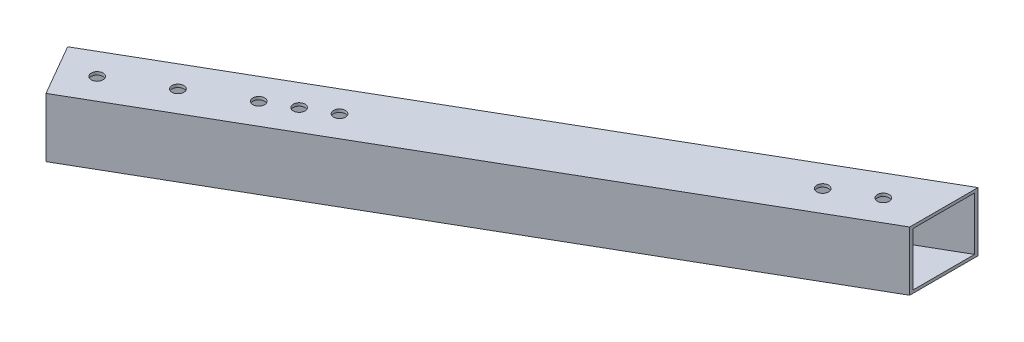
ISO-10303-21;
HEADER;
FILE_DESCRIPTION(('STEP AP214'),'2;1');
FILE_NAME('part.step','',(''),(''),'','','');
FILE_SCHEMA(('AUTOMOTIVE_DESIGN { 1 0 10303 214 1 1 1 1 }'));
ENDSEC;
DATA;
#1=APPLICATION_CONTEXT('core data for automotive mechanical design processes');
#2=APPLICATION_PROTOCOL_DEFINITION('international standard','automotive_design',2000,#1);
#3=PRODUCT_CONTEXT('',#1,'mechanical');
#4=PRODUCT('Part','Part','',(#3));
#5=PRODUCT_RELATED_PRODUCT_CATEGORY('part','',(#4));
#6=PRODUCT_DEFINITION_FORMATION('','',#4);
#7=PRODUCT_DEFINITION_CONTEXT('part definition',#1,'design');
#8=PRODUCT_DEFINITION('design','',#6,#7);
#9=PRODUCT_DEFINITION_SHAPE('','',#8);
#10=(LENGTH_UNIT() NAMED_UNIT(*) SI_UNIT(.MILLI.,.METRE.));
#11=(NAMED_UNIT(*) PLANE_ANGLE_UNIT() SI_UNIT($,.RADIAN.));
#12=(NAMED_UNIT(*) SI_UNIT($,.STERADIAN.) SOLID_ANGLE_UNIT());
#13=UNCERTAINTY_MEASURE_WITH_UNIT(LENGTH_MEASURE(1.E-05),#10,'distance_accuracy_value','');
#14=(GEOMETRIC_REPRESENTATION_CONTEXT(3) GLOBAL_UNCERTAINTY_ASSIGNED_CONTEXT((#13)) GLOBAL_UNIT_ASSIGNED_CONTEXT((#10,
#11,#12)) REPRESENTATION_CONTEXT('',''));
#15=CARTESIAN_POINT('',(0.,0.,0.));
#16=DIRECTION('',(0.,0.,1.));
#17=DIRECTION('',(1.,0.,0.));
#18=AXIS2_PLACEMENT_3D('',#15,#16,#17);
#19=CARTESIAN_POINT('',(-83.4815172738184,20.,51.4866802115003));
#20=DIRECTION('',(0.,-1.,0.));
#21=DIRECTION('',(0.,0.,-1.));
#22=AXIS2_PLACEMENT_3D('',#19,#20,#21);
#23=CYLINDRICAL_SURFACE('',#22,1.99999999999997);
#24=CARTESIAN_POINT('',(-83.4815172738184,1.,51.4866802115003));
#25=DIRECTION('',(0.,-1.,0.));
#26=DIRECTION('',(0.,0.,-1.));
#27=AXIS2_PLACEMENT_3D('',#24,#25,#26);
#28=CIRCLE('',#27,1.99999999999997);
#29=CARTESIAN_POINT('',(-83.4815172738184,1.,49.4866802115003));
#30=VERTEX_POINT('',#29);
#31=EDGE_CURVE('E194',#30,#30,#28,.T.);
#32=ORIENTED_EDGE('',*,*,#31,.F.);
#33=EDGE_LOOP('',(#32));
#34=FACE_BOUND('',#33,.T.);
#35=CARTESIAN_POINT('',(-83.4815172738184,0.,51.4866802115003));
#36=DIRECTION('',(0.,1.,0.));
#37=DIRECTION('',(0.,0.,1.));
#38=AXIS2_PLACEMENT_3D('',#35,#36,#37);
#39=CIRCLE('',#38,1.99999999999997);
#40=CARTESIAN_POINT('',(-83.4815172738184,0.,53.4866802115002));
#41=VERTEX_POINT('',#40);
#42=EDGE_CURVE('E247',#41,#41,#39,.T.);
#43=ORIENTED_EDGE('',*,*,#42,.F.);
#44=EDGE_LOOP('',(#43));
#45=FACE_BOUND('',#44,.T.);
#46=ADVANCED_FACE('F45',(#34,#45),#23,.F.);
#47=CARTESIAN_POINT('',(-66.1610091981294,20.,41.4866802115005));
#48=DIRECTION('',(0.,-1.,0.));
#49=DIRECTION('',(0.,0.,-1.));
#50=AXIS2_PLACEMENT_3D('',#47,#48,#49);
#51=CYLINDRICAL_SURFACE('',#50,2.00000000000002);
#52=CARTESIAN_POINT('',(-66.1610091981294,1.00000000000001,41.4866802115005));
#53=DIRECTION('',(0.,-1.,0.));
#54=DIRECTION('',(0.,0.,-1.));
#55=AXIS2_PLACEMENT_3D('',#52,#53,#54);
#56=CIRCLE('',#55,2.00000000000002);
#57=CARTESIAN_POINT('',(-66.1610091981294,1.00000000000001,39.4866802115005));
#58=VERTEX_POINT('',#57);
#59=EDGE_CURVE('E190',#58,#58,#56,.T.);
#60=ORIENTED_EDGE('',*,*,#59,.F.);
#61=EDGE_LOOP('',(#60));
#62=FACE_BOUND('',#61,.T.);
#63=CARTESIAN_POINT('',(-66.1610091981294,0.,41.4866802115005));
#64=DIRECTION('',(0.,1.,0.));
#65=DIRECTION('',(0.,0.,1.));
#66=AXIS2_PLACEMENT_3D('',#63,#64,#65);
#67=CIRCLE('',#66,2.00000000000002);
#68=CARTESIAN_POINT('',(-66.1610091981294,0.,43.4866802115005));
#69=VERTEX_POINT('',#68);
#70=EDGE_CURVE('E239',#69,#69,#67,.T.);
#71=ORIENTED_EDGE('',*,*,#70,.F.);
#72=EDGE_LOOP('',(#71));
#73=FACE_BOUND('',#72,.T.);
#74=ADVANCED_FACE('F326',(#62,#73),#51,.F.);
#75=CARTESIAN_POINT('',(-48.8696225304549,20.,31.4379725042907));
#76=DIRECTION('',(0.,-1.,0.));
#77=DIRECTION('',(0.,0.,-1.));
#78=AXIS2_PLACEMENT_3D('',#75,#76,#77);
#79=CYLINDRICAL_SURFACE('',#78,2.);
#80=CARTESIAN_POINT('',(-48.8696225304549,1.,31.4379725042907));
#81=DIRECTION('',(0.,-1.,0.));
#82=DIRECTION('',(0.,0.,-1.));
#83=AXIS2_PLACEMENT_3D('',#80,#81,#82);
#84=CIRCLE('',#83,2.);
#85=CARTESIAN_POINT('',(-48.8696225304549,1.,29.4379725042907));
#86=VERTEX_POINT('',#85);
#87=EDGE_CURVE('E186',#86,#86,#84,.T.);
#88=ORIENTED_EDGE('',*,*,#87,.F.);
#89=EDGE_LOOP('',(#88));
#90=FACE_BOUND('',#89,.T.);
#91=CARTESIAN_POINT('',(-48.8696225304549,0.,31.4379725042907));
#92=DIRECTION('',(0.,1.,0.));
#93=DIRECTION('',(0.,0.,1.));
#94=AXIS2_PLACEMENT_3D('',#91,#92,#93);
#95=CIRCLE('',#94,2.);
#96=CARTESIAN_POINT('',(-48.8696225304549,0.,33.4379725042907));
#97=VERTEX_POINT('',#96);
#98=EDGE_CURVE('E231',#97,#97,#95,.T.);
#99=ORIENTED_EDGE('',*,*,#98,.F.);
#100=EDGE_LOOP('',(#99));
#101=FACE_BOUND('',#100,.T.);
#102=ADVANCED_FACE('F334',(#90,#101),#79,.F.);
#103=CARTESIAN_POINT('',(-40.2093684926109,20.,26.4379725042909));
#104=DIRECTION('',(0.,-1.,0.));
#105=DIRECTION('',(0.,0.,-1.));
#106=AXIS2_PLACEMENT_3D('',#103,#104,#105);
#107=CYLINDRICAL_SURFACE('',#106,2.00000000000002);
#108=CARTESIAN_POINT('',(-40.2093684926109,1.,26.4379725042909));
#109=DIRECTION('',(0.,-1.,0.));
#110=DIRECTION('',(0.,0.,-1.));
#111=AXIS2_PLACEMENT_3D('',#108,#109,#110);
#112=CIRCLE('',#111,2.00000000000002);
#113=CARTESIAN_POINT('',(-40.2093684926109,1.,24.4379725042909));
#114=VERTEX_POINT('',#113);
#115=EDGE_CURVE('E182',#114,#114,#112,.T.);
#116=ORIENTED_EDGE('',*,*,#115,.F.);
#117=EDGE_LOOP('',(#116));
#118=FACE_BOUND('',#117,.T.);
#119=CARTESIAN_POINT('',(-40.2093684926109,0.,26.4379725042909));
#120=DIRECTION('',(0.,1.,0.));
#121=DIRECTION('',(0.,0.,1.));
#122=AXIS2_PLACEMENT_3D('',#119,#120,#121);
#123=CIRCLE('',#122,2.00000000000002);
#124=CARTESIAN_POINT('',(-40.2093684926109,0.,28.4379725042909));
#125=VERTEX_POINT('',#124);
#126=EDGE_CURVE('E223',#125,#125,#123,.T.);
#127=ORIENTED_EDGE('',*,*,#126,.F.);
#128=EDGE_LOOP('',(#127));
#129=FACE_BOUND('',#128,.T.);
#130=ADVANCED_FACE('F449',(#118,#129),#107,.F.);
#131=CARTESIAN_POINT('',(-31.5491144547664,20.,21.4379725042909));
#132=DIRECTION('',(0.,-1.,0.));
#133=DIRECTION('',(0.,0.,-1.));
#134=AXIS2_PLACEMENT_3D('',#131,#132,#133);
#135=CYLINDRICAL_SURFACE('',#134,1.99999999999957);
#136=CARTESIAN_POINT('',(-31.5491144547664,1.,21.4379725042909));
#137=DIRECTION('',(0.,-1.,0.));
#138=DIRECTION('',(0.,0.,-1.));
#139=AXIS2_PLACEMENT_3D('',#136,#137,#138);
#140=CIRCLE('',#139,1.99999999999957);
#141=CARTESIAN_POINT('',(-31.5491144547664,1.,19.4379725042913));
#142=VERTEX_POINT('',#141);
#143=EDGE_CURVE('E178',#142,#142,#140,.T.);
#144=ORIENTED_EDGE('',*,*,#143,.F.);
#145=EDGE_LOOP('',(#144));
#146=FACE_BOUND('',#145,.T.);
#147=CARTESIAN_POINT('',(-31.5491144547664,0.,21.4379725042909));
#148=DIRECTION('',(0.,1.,0.));
#149=DIRECTION('',(0.,0.,1.));
#150=AXIS2_PLACEMENT_3D('',#147,#148,#149);
#151=CIRCLE('',#150,1.99999999999957);
#152=CARTESIAN_POINT('',(-31.5491144547664,0.,23.4379725042905));
#153=VERTEX_POINT('',#152);
#154=EDGE_CURVE('E215',#153,#153,#151,.T.);
#155=ORIENTED_EDGE('',*,*,#154,.F.);
#156=EDGE_LOOP('',(#155));
#157=FACE_BOUND('',#156,.T.);
#158=ADVANCED_FACE('F388',(#146,#157),#135,.F.);
#159=CARTESIAN_POINT('',(72.0554584989076,20.,-38.3781555797895));
#160=DIRECTION('',(0.,-1.,0.));
#161=DIRECTION('',(0.,0.,-1.));
#162=AXIS2_PLACEMENT_3D('',#159,#160,#161);
#163=CYLINDRICAL_SURFACE('',#162,2.);
#164=CARTESIAN_POINT('',(72.0554584989076,1.,-38.3781555797895));
#165=DIRECTION('',(0.,-1.,0.));
#166=DIRECTION('',(0.,0.,-1.));
#167=AXIS2_PLACEMENT_3D('',#164,#165,#166);
#168=CIRCLE('',#167,2.);
#169=CARTESIAN_POINT('',(72.0554584989076,1.,-40.3781555797895));
#170=VERTEX_POINT('',#169);
#171=EDGE_CURVE('E174',#170,#170,#168,.T.);
#172=ORIENTED_EDGE('',*,*,#171,.F.);
#173=EDGE_LOOP('',(#172));
#174=FACE_BOUND('',#173,.T.);
#175=CARTESIAN_POINT('',(72.0554584989076,0.,-38.3781555797895));
#176=DIRECTION('',(0.,1.,0.));
#177=DIRECTION('',(0.,0.,1.));
#178=AXIS2_PLACEMENT_3D('',#175,#176,#177);
#179=CIRCLE('',#178,2.);
#180=CARTESIAN_POINT('',(72.0554584989076,0.,-36.3781555797895));
#181=VERTEX_POINT('',#180);
#182=EDGE_CURVE('E207',#181,#181,#179,.T.);
#183=ORIENTED_EDGE('',*,*,#182,.F.);
#184=EDGE_LOOP('',(#183));
#185=FACE_BOUND('',#184,.T.);
#186=ADVANCED_FACE('F380',(#174,#185),#163,.F.);
#187=CARTESIAN_POINT('',(85.0458395556742,20.,-45.8781555797896));
#188=DIRECTION('',(0.,-1.,0.));
#189=DIRECTION('',(0.,0.,-1.));
#190=AXIS2_PLACEMENT_3D('',#187,#188,#189);
#191=CYLINDRICAL_SURFACE('',#190,2.00000000000004);
#192=CARTESIAN_POINT('',(85.0458395556742,1.,-45.8781555797896));
#193=DIRECTION('',(0.,-1.,0.));
#194=DIRECTION('',(0.,0.,-1.));
#195=AXIS2_PLACEMENT_3D('',#192,#193,#194);
#196=CIRCLE('',#195,2.00000000000004);
#197=CARTESIAN_POINT('',(85.0458395556742,1.,-47.8781555797896));
#198=VERTEX_POINT('',#197);
#199=EDGE_CURVE('E173',#198,#198,#196,.T.);
#200=ORIENTED_EDGE('',*,*,#199,.F.);
#201=EDGE_LOOP('',(#200));
#202=FACE_BOUND('',#201,.T.);
#203=CARTESIAN_POINT('',(85.0458395556742,0.,-45.8781555797896));
#204=DIRECTION('',(0.,1.,0.));
#205=DIRECTION('',(0.,0.,1.));
#206=AXIS2_PLACEMENT_3D('',#203,#204,#205);
#207=CIRCLE('',#206,2.00000000000004);
#208=CARTESIAN_POINT('',(85.0458395556742,0.,-43.8781555797895));
#209=VERTEX_POINT('',#208);
#210=EDGE_CURVE('E202',#209,#209,#207,.T.);
#211=ORIENTED_EDGE('',*,*,#210,.F.);
#212=EDGE_LOOP('',(#211));
#213=FACE_BOUND('',#212,.T.);
#214=ADVANCED_FACE('F359',(#202,#213),#191,.F.);
#215=CARTESIAN_POINT('',(0.,20.,0.));
#216=DIRECTION('',(0.,1.,0.));
#217=DIRECTION('',(0.,0.,1.));
#218=AXIS2_PLACEMENT_3D('',#215,#216,#217);
#219=PLANE('',#218);
#220=CARTESIAN_POINT('',(72.0554584989076,20.,-38.3781555797895));
#221=DIRECTION('',(0.,1.,0.));
#222=DIRECTION('',(0.,0.,1.));
#223=AXIS2_PLACEMENT_3D('',#220,#221,#222);
#224=CIRCLE('',#223,2.);
#225=CARTESIAN_POINT('',(72.0554584989076,20.,-36.3781555797895));
#226=VERTEX_POINT('',#225);
#227=EDGE_CURVE('E211',#226,#226,#224,.T.);
#228=ORIENTED_EDGE('',*,*,#227,.F.);
#229=EDGE_LOOP('',(#228));
#230=FACE_BOUND('',#229,.T.);
#231=CARTESIAN_POINT('',(-40.2093684926109,20.,26.4379725042909));
#232=DIRECTION('',(0.,1.,0.));
#233=DIRECTION('',(0.,0.,1.));
#234=AXIS2_PLACEMENT_3D('',#231,#232,#233);
#235=CIRCLE('',#234,2.00000000000002);
#236=CARTESIAN_POINT('',(-40.2093684926109,20.,28.4379725042909));
#237=VERTEX_POINT('',#236);
#238=EDGE_CURVE('E227',#237,#237,#235,.T.);
#239=ORIENTED_EDGE('',*,*,#238,.F.);
#240=EDGE_LOOP('',(#239));
#241=FACE_BOUND('',#240,.T.);
#242=CARTESIAN_POINT('',(-66.1610091981294,20.,41.4866802115005));
#243=DIRECTION('',(0.,1.,0.));
#244=DIRECTION('',(0.,0.,1.));
#245=AXIS2_PLACEMENT_3D('',#242,#243,#244);
#246=CIRCLE('',#245,2.00000000000002);
#247=CARTESIAN_POINT('',(-66.1610091981294,20.,43.4866802115005));
#248=VERTEX_POINT('',#247);
#249=EDGE_CURVE('E243',#248,#248,#246,.T.);
#250=ORIENTED_EDGE('',*,*,#249,.F.);
#251=EDGE_LOOP('',(#250));
#252=FACE_BOUND('',#251,.T.);
#253=DIRECTION('',(-0.866025403784439,0.,0.5));
#254=VECTOR('',#253,1.);
#255=CARTESIAN_POINT('',(-97.1708927196769,20.,47.777718466446));
#256=LINE('',#255,#254);
#257=CARTESIAN_POINT('',(98.0362206124406,20.,-64.9251609635819));
#258=VERTEX_POINT('',#257);
#259=CARTESIAN_POINT('',(-97.1708927196769,20.,47.777718466446));
#260=VERTEX_POINT('',#259);
#261=EDGE_CURVE('E259',#258,#260,#256,.T.);
#262=ORIENTED_EDGE('',*,*,#261,.T.);
#263=DIRECTION('',(0.500000000000001,0.,0.866025403784438));
#264=VECTOR('',#263,1.);
#265=CARTESIAN_POINT('',(-87.1708927196769,20.,65.0982265421347));
#266=LINE('',#265,#264);
#267=CARTESIAN_POINT('',(-87.1708927196769,20.,65.0982265421347));
#268=VERTEX_POINT('',#267);
#269=EDGE_CURVE('E263',#260,#268,#266,.T.);
#270=ORIENTED_EDGE('',*,*,#269,.T.);
#271=DIRECTION('',(0.866025403784438,0.,-0.500000000000001));
#272=VECTOR('',#271,1.);
#273=CARTESIAN_POINT('',(98.0362206124406,20.,-41.8311501959971));
#274=LINE('',#273,#272);
#275=CARTESIAN_POINT('',(98.0362206124406,20.,-41.8311501959971));
#276=VERTEX_POINT('',#275);
#277=EDGE_CURVE('E267',#268,#276,#274,.T.);
#278=ORIENTED_EDGE('',*,*,#277,.T.);
#279=DIRECTION('',(0.,0.,-1.));
#280=VECTOR('',#279,1.);
#281=CARTESIAN_POINT('',(98.0362206124406,20.,-64.9251609635819));
#282=LINE('',#281,#280);
#283=EDGE_CURVE('E270',#276,#258,#282,.T.);
#284=ORIENTED_EDGE('',*,*,#283,.T.);
#285=EDGE_LOOP('',(#262,#270,#278,#284));
#286=FACE_BOUND('',#285,.T.);
#287=CARTESIAN_POINT('',(-83.4815172738184,20.,51.4866802115003));
#288=DIRECTION('',(0.,1.,0.));
#289=DIRECTION('',(0.,0.,1.));
#290=AXIS2_PLACEMENT_3D('',#287,#288,#289);
#291=CIRCLE('',#290,1.99999999999997);
#292=CARTESIAN_POINT('',(-83.4815172738184,20.,53.4866802115002));
#293=VERTEX_POINT('',#292);
#294=EDGE_CURVE('E251',#293,#293,#291,.T.);
#295=ORIENTED_EDGE('',*,*,#294,.F.);
#296=EDGE_LOOP('',(#295));
#297=FACE_BOUND('',#296,.T.);
#298=CARTESIAN_POINT('',(-48.8696225304549,20.,31.4379725042907));
#299=DIRECTION('',(0.,1.,0.));
#300=DIRECTION('',(0.,0.,1.));
#301=AXIS2_PLACEMENT_3D('',#298,#299,#300);
#302=CIRCLE('',#301,2.);
#303=CARTESIAN_POINT('',(-48.8696225304549,20.,33.4379725042907));
#304=VERTEX_POINT('',#303);
#305=EDGE_CURVE('E235',#304,#304,#302,.T.);
#306=ORIENTED_EDGE('',*,*,#305,.F.);
#307=EDGE_LOOP('',(#306));
#308=FACE_BOUND('',#307,.T.);
#309=CARTESIAN_POINT('',(-31.5491144547664,20.,21.4379725042909));
#310=DIRECTION('',(0.,1.,0.));
#311=DIRECTION('',(0.,0.,1.));
#312=AXIS2_PLACEMENT_3D('',#309,#310,#311);
#313=CIRCLE('',#312,1.99999999999957);
#314=CARTESIAN_POINT('',(-31.5491144547664,20.,23.4379725042905));
#315=VERTEX_POINT('',#314);
#316=EDGE_CURVE('E219',#315,#315,#313,.T.);
#317=ORIENTED_EDGE('',*,*,#316,.F.);
#318=EDGE_LOOP('',(#317));
#319=FACE_BOUND('',#318,.T.);
#320=CARTESIAN_POINT('',(85.0458395556742,20.,-45.8781555797896));
#321=DIRECTION('',(0.,1.,0.));
#322=DIRECTION('',(0.,0.,1.));
#323=AXIS2_PLACEMENT_3D('',#320,#321,#322);
#324=CIRCLE('',#323,2.00000000000004);
#325=CARTESIAN_POINT('',(85.0458395556742,20.,-43.8781555797895));
#326=VERTEX_POINT('',#325);
#327=EDGE_CURVE('E203',#326,#326,#324,.T.);
#328=ORIENTED_EDGE('',*,*,#327,.F.);
#329=EDGE_LOOP('',(#328));
#330=FACE_BOUND('',#329,.T.);
#331=ADVANCED_FACE('F355',(#230,#241,#252,#286,#297,#308,#319,#330),#219,.T.);
#332=CARTESIAN_POINT('',(0.,0.,0.));
#333=DIRECTION('',(0.,1.,0.));
#334=DIRECTION('',(0.,0.,1.));
#335=AXIS2_PLACEMENT_3D('',#332,#333,#334);
#336=PLANE('',#335);
#337=DIRECTION('',(-0.866025403784439,0.,0.5));
#338=VECTOR('',#337,1.);
#339=CARTESIAN_POINT('',(-97.1708927196769,0.,47.777718466446));
#340=LINE('',#339,#338);
#341=CARTESIAN_POINT('',(98.0362206124406,0.,-64.9251609635819));
#342=VERTEX_POINT('',#341);
#343=CARTESIAN_POINT('',(-97.1708927196769,0.,47.777718466446));
#344=VERTEX_POINT('',#343);
#345=EDGE_CURVE('E255',#342,#344,#340,.T.);
#346=ORIENTED_EDGE('',*,*,#345,.F.);
#347=DIRECTION('',(0.,0.,-1.));
#348=VECTOR('',#347,1.);
#349=CARTESIAN_POINT('',(98.0362206124406,0.,-64.9251609635819));
#350=LINE('',#349,#348);
#351=CARTESIAN_POINT('',(98.0362206124406,0.,-41.8311501959971));
#352=VERTEX_POINT('',#351);
#353=EDGE_CURVE('E264',#352,#342,#350,.T.);
#354=ORIENTED_EDGE('',*,*,#353,.F.);
#355=DIRECTION('',(0.866025403784438,0.,-0.500000000000001));
#356=VECTOR('',#355,1.);
#357=CARTESIAN_POINT('',(98.0362206124406,0.,-41.8311501959971));
#358=LINE('',#357,#356);
#359=CARTESIAN_POINT('',(-87.1708927196769,0.,65.0982265421347));
#360=VERTEX_POINT('',#359);
#361=EDGE_CURVE('E280',#360,#352,#358,.T.);
#362=ORIENTED_EDGE('',*,*,#361,.F.);
#363=DIRECTION('',(0.500000000000001,0.,0.866025403784438));
#364=VECTOR('',#363,1.);
#365=CARTESIAN_POINT('',(-87.1708927196769,0.,65.0982265421347));
#366=LINE('',#365,#364);
#367=EDGE_CURVE('E277',#344,#360,#366,.T.);
#368=ORIENTED_EDGE('',*,*,#367,.F.);
#369=EDGE_LOOP('',(#346,#354,#362,#368));
#370=FACE_BOUND('',#369,.T.);
#371=ORIENTED_EDGE('',*,*,#42,.T.);
#372=EDGE_LOOP('',(#371));
#373=FACE_BOUND('',#372,.T.);
#374=ORIENTED_EDGE('',*,*,#70,.T.);
#375=EDGE_LOOP('',(#374));
#376=FACE_BOUND('',#375,.T.);
#377=ORIENTED_EDGE('',*,*,#98,.T.);
#378=EDGE_LOOP('',(#377));
#379=FACE_BOUND('',#378,.T.);
#380=ORIENTED_EDGE('',*,*,#126,.T.);
#381=EDGE_LOOP('',(#380));
#382=FACE_BOUND('',#381,.T.);
#383=ORIENTED_EDGE('',*,*,#154,.T.);
#384=EDGE_LOOP('',(#383));
#385=FACE_BOUND('',#384,.T.);
#386=ORIENTED_EDGE('',*,*,#182,.T.);
#387=EDGE_LOOP('',(#386));
#388=FACE_BOUND('',#387,.T.);
#389=ORIENTED_EDGE('',*,*,#210,.T.);
#390=EDGE_LOOP('',(#389));
#391=FACE_BOUND('',#390,.T.);
#392=ADVANCED_FACE('F358',(#370,#373,#376,#379,#382,#385,#388,#391),#336,.F.);
#393=CARTESIAN_POINT('',(-97.1708927196769,20.,47.777718466446));
#394=DIRECTION('',(0.5,0.,0.866025403784438));
#395=DIRECTION('',(0.866025403784439,0.,-0.5));
#396=AXIS2_PLACEMENT_3D('',#393,#394,#395);
#397=PLANE('',#396);
#398=ORIENTED_EDGE('',*,*,#345,.T.);
#399=DIRECTION('',(0.,-1.,0.));
#400=VECTOR('',#399,1.);
#401=CARTESIAN_POINT('',(-97.1708927196769,20.,47.777718466446));
#402=LINE('',#401,#400);
#403=EDGE_CURVE('E296',#260,#344,#402,.T.);
#404=ORIENTED_EDGE('',*,*,#403,.F.);
#405=ORIENTED_EDGE('',*,*,#261,.F.);
#406=DIRECTION('',(0.,-1.,0.));
#407=VECTOR('',#406,1.);
#408=CARTESIAN_POINT('',(98.0362206124406,20.,-64.9251609635819));
#409=LINE('',#408,#407);
#410=EDGE_CURVE('E273',#258,#342,#409,.T.);
#411=ORIENTED_EDGE('',*,*,#410,.T.);
#412=EDGE_LOOP('',(#398,#404,#405,#411));
#413=FACE_BOUND('',#412,.T.);
#414=ADVANCED_FACE('F47',(#413),#397,.F.);
#415=CARTESIAN_POINT('',(-87.1708927196769,20.,65.0982265421347));
#416=DIRECTION('',(0.866025403784438,0.,-0.500000000000001));
#417=DIRECTION('',(-0.500000000000001,0.,-0.866025403784438));
#418=AXIS2_PLACEMENT_3D('',#415,#416,#417);
#419=PLANE('',#418);
#420=DIRECTION('',(-0.500000000000001,0.,-0.866025403784438));
#421=VECTOR('',#420,1.);
#422=CARTESIAN_POINT('',(-96.670892719677,19.,48.6437438702304));
#423=LINE('',#422,#421);
#424=CARTESIAN_POINT('',(-87.6708927196769,19.,64.2322011383503));
#425=VERTEX_POINT('',#424);
#426=CARTESIAN_POINT('',(-96.670892719677,19.,48.6437438702304));
#427=VERTEX_POINT('',#426);
#428=EDGE_CURVE('E123',#425,#427,#423,.T.);
#429=ORIENTED_EDGE('',*,*,#428,.F.);
#430=DIRECTION('',(0.,1.,0.));
#431=VECTOR('',#430,1.);
#432=CARTESIAN_POINT('',(-87.6708927196769,19.,64.2322011383503));
#433=LINE('',#432,#431);
#434=CARTESIAN_POINT('',(-87.6708927196769,1.,64.2322011383503));
#435=VERTEX_POINT('',#434);
#436=EDGE_CURVE('E61',#435,#425,#433,.T.);
#437=ORIENTED_EDGE('',*,*,#436,.F.);
#438=DIRECTION('',(0.500000000000001,0.,0.866025403784438));
#439=VECTOR('',#438,1.);
#440=CARTESIAN_POINT('',(-96.670892719677,1.,48.6437438702304));
#441=LINE('',#440,#439);
#442=CARTESIAN_POINT('',(-96.670892719677,1.,48.6437438702304));
#443=VERTEX_POINT('',#442);
#444=EDGE_CURVE('E131',#443,#435,#441,.T.);
#445=ORIENTED_EDGE('',*,*,#444,.F.);
#446=DIRECTION('',(0.,-1.,0.));
#447=VECTOR('',#446,1.);
#448=CARTESIAN_POINT('',(-96.670892719677,19.,48.6437438702304));
#449=LINE('',#448,#447);
#450=EDGE_CURVE('E114',#427,#443,#449,.T.);
#451=ORIENTED_EDGE('',*,*,#450,.F.);
#452=EDGE_LOOP('',(#429,#437,#445,#451));
#453=FACE_BOUND('',#452,.T.);
#454=ORIENTED_EDGE('',*,*,#367,.T.);
#455=DIRECTION('',(0.,-1.,0.));
#456=VECTOR('',#455,1.);
#457=CARTESIAN_POINT('',(-87.1708927196769,20.,65.0982265421347));
#458=LINE('',#457,#456);
#459=EDGE_CURVE('E292',#268,#360,#458,.T.);
#460=ORIENTED_EDGE('',*,*,#459,.F.);
#461=ORIENTED_EDGE('',*,*,#269,.F.);
#462=ORIENTED_EDGE('',*,*,#403,.T.);
#463=EDGE_LOOP('',(#454,#460,#461,#462));
#464=FACE_BOUND('',#463,.T.);
#465=ADVANCED_FACE('F128',(#453,#464),#419,.F.);
#466=CARTESIAN_POINT('',(98.0362206124406,20.,-41.8311501959971));
#467=DIRECTION('',(-0.500000000000001,0.,-0.866025403784438));
#468=DIRECTION('',(-0.866025403784438,0.,0.500000000000001));
#469=AXIS2_PLACEMENT_3D('',#466,#467,#468);
#470=PLANE('',#469);
#471=ORIENTED_EDGE('',*,*,#361,.T.);
#472=DIRECTION('',(0.,-1.,0.));
#473=VECTOR('',#472,1.);
#474=CARTESIAN_POINT('',(98.0362206124406,20.,-41.8311501959971));
#475=LINE('',#474,#473);
#476=EDGE_CURVE('E288',#276,#352,#475,.T.);
#477=ORIENTED_EDGE('',*,*,#476,.F.);
#478=ORIENTED_EDGE('',*,*,#277,.F.);
#479=ORIENTED_EDGE('',*,*,#459,.T.);
#480=EDGE_LOOP('',(#471,#477,#478,#479));
#481=FACE_BOUND('',#480,.T.);
#482=ADVANCED_FACE('F349',(#481),#470,.F.);
#483=CARTESIAN_POINT('',(98.0362206124406,20.,-64.9251609635819));
#484=DIRECTION('',(-1.,0.,0.));
#485=DIRECTION('',(0.,0.,1.));
#486=AXIS2_PLACEMENT_3D('',#483,#484,#485);
#487=PLANE('',#486);
#488=DIRECTION('',(0.,0.,1.));
#489=VECTOR('',#488,1.);
#490=CARTESIAN_POINT('',(98.0362206124406,1.,-64.9251609635819));
#491=LINE('',#490,#489);
#492=CARTESIAN_POINT('',(98.0362206124406,1.,-63.7704604252029));
#493=VERTEX_POINT('',#492);
#494=CARTESIAN_POINT('',(98.0362206124406,1.,-42.9858507343764));
#495=VERTEX_POINT('',#494);
#496=EDGE_CURVE('E198',#493,#495,#491,.T.);
#497=ORIENTED_EDGE('',*,*,#496,.T.);
#498=DIRECTION('',(0.,1.,0.));
#499=VECTOR('',#498,1.);
#500=CARTESIAN_POINT('',(98.0362206124406,20.,-42.9858507343764));
#501=LINE('',#500,#499);
#502=CARTESIAN_POINT('',(98.0362206124406,19.,-42.9858507343764));
#503=VERTEX_POINT('',#502);
#504=EDGE_CURVE('E11',#495,#503,#501,.T.);
#505=ORIENTED_EDGE('',*,*,#504,.T.);
#506=DIRECTION('',(0.,0.,-1.));
#507=VECTOR('',#506,1.);
#508=CARTESIAN_POINT('',(98.0362206124406,19.,-64.9251609635819));
#509=LINE('',#508,#507);
#510=CARTESIAN_POINT('',(98.0362206124406,19.,-63.7704604252029));
#511=VERTEX_POINT('',#510);
#512=EDGE_CURVE('E170',#503,#511,#509,.T.);
#513=ORIENTED_EDGE('',*,*,#512,.T.);
#514=DIRECTION('',(0.,-1.,0.));
#515=VECTOR('',#514,1.);
#516=CARTESIAN_POINT('',(98.0362206124406,20.,-63.7704604252029));
#517=LINE('',#516,#515);
#518=EDGE_CURVE('E54',#511,#493,#517,.T.);
#519=ORIENTED_EDGE('',*,*,#518,.T.);
#520=EDGE_LOOP('',(#497,#505,#513,#519));
#521=FACE_BOUND('',#520,.T.);
#522=ORIENTED_EDGE('',*,*,#353,.T.);
#523=ORIENTED_EDGE('',*,*,#410,.F.);
#524=ORIENTED_EDGE('',*,*,#283,.F.);
#525=ORIENTED_EDGE('',*,*,#476,.T.);
#526=EDGE_LOOP('',(#522,#523,#524,#525));
#527=FACE_BOUND('',#526,.T.);
#528=ADVANCED_FACE('F307',(#521,#527),#487,.F.);
#529=CARTESIAN_POINT('',(-83.4815172738184,19.,51.4866802115003));
#530=DIRECTION('',(0.,1.,0.));
#531=DIRECTION('',(0.,0.,1.));
#532=AXIS2_PLACEMENT_3D('',#529,#530,#531);
#533=CIRCLE('',#532,1.99999999999997);
#534=CARTESIAN_POINT('',(-83.4815172738184,19.,53.4866802115002));
#535=VERTEX_POINT('',#534);
#536=EDGE_CURVE('E166',#535,#535,#533,.T.);
#537=ORIENTED_EDGE('',*,*,#536,.F.);
#538=EDGE_LOOP('',(#537));
#539=FACE_BOUND('',#538,.T.);
#540=ORIENTED_EDGE('',*,*,#294,.T.);
#541=EDGE_LOOP('',(#540));
#542=FACE_BOUND('',#541,.T.);
#543=ADVANCED_FACE('F329',(#539,#542),#23,.F.);
#544=CARTESIAN_POINT('',(-66.1610091981294,19.,41.4866802115005));
#545=DIRECTION('',(0.,1.,0.));
#546=DIRECTION('',(0.,0.,1.));
#547=AXIS2_PLACEMENT_3D('',#544,#545,#546);
#548=CIRCLE('',#547,2.00000000000002);
#549=CARTESIAN_POINT('',(-66.1610091981294,19.,43.4866802115005));
#550=VERTEX_POINT('',#549);
#551=EDGE_CURVE('E162',#550,#550,#548,.T.);
#552=ORIENTED_EDGE('',*,*,#551,.F.);
#553=EDGE_LOOP('',(#552));
#554=FACE_BOUND('',#553,.T.);
#555=ORIENTED_EDGE('',*,*,#249,.T.);
#556=EDGE_LOOP('',(#555));
#557=FACE_BOUND('',#556,.T.);
#558=ADVANCED_FACE('F337',(#554,#557),#51,.F.);
#559=CARTESIAN_POINT('',(-48.8696225304549,19.,31.4379725042907));
#560=DIRECTION('',(0.,1.,0.));
#561=DIRECTION('',(0.,0.,1.));
#562=AXIS2_PLACEMENT_3D('',#559,#560,#561);
#563=CIRCLE('',#562,2.);
#564=CARTESIAN_POINT('',(-48.8696225304549,19.,33.4379725042907));
#565=VERTEX_POINT('',#564);
#566=EDGE_CURVE('E158',#565,#565,#563,.T.);
#567=ORIENTED_EDGE('',*,*,#566,.F.);
#568=EDGE_LOOP('',(#567));
#569=FACE_BOUND('',#568,.T.);
#570=ORIENTED_EDGE('',*,*,#305,.T.);
#571=EDGE_LOOP('',(#570));
#572=FACE_BOUND('',#571,.T.);
#573=ADVANCED_FACE('F347',(#569,#572),#79,.F.);
#574=CARTESIAN_POINT('',(-40.2093684926109,19.,26.4379725042909));
#575=DIRECTION('',(0.,1.,0.));
#576=DIRECTION('',(0.,0.,1.));
#577=AXIS2_PLACEMENT_3D('',#574,#575,#576);
#578=CIRCLE('',#577,2.00000000000002);
#579=CARTESIAN_POINT('',(-40.2093684926109,19.,28.4379725042909));
#580=VERTEX_POINT('',#579);
#581=EDGE_CURVE('E154',#580,#580,#578,.T.);
#582=ORIENTED_EDGE('',*,*,#581,.F.);
#583=EDGE_LOOP('',(#582));
#584=FACE_BOUND('',#583,.T.);
#585=ORIENTED_EDGE('',*,*,#238,.T.);
#586=EDGE_LOOP('',(#585));
#587=FACE_BOUND('',#586,.T.);
#588=ADVANCED_FACE('F437',(#584,#587),#107,.F.);
#589=CARTESIAN_POINT('',(-31.5491144547664,19.,21.4379725042909));
#590=DIRECTION('',(0.,1.,0.));
#591=DIRECTION('',(0.,0.,1.));
#592=AXIS2_PLACEMENT_3D('',#589,#590,#591);
#593=CIRCLE('',#592,1.99999999999957);
#594=CARTESIAN_POINT('',(-31.5491144547664,19.,23.4379725042905));
#595=VERTEX_POINT('',#594);
#596=EDGE_CURVE('E150',#595,#595,#593,.T.);
#597=ORIENTED_EDGE('',*,*,#596,.F.);
#598=EDGE_LOOP('',(#597));
#599=FACE_BOUND('',#598,.T.);
#600=ORIENTED_EDGE('',*,*,#316,.T.);
#601=EDGE_LOOP('',(#600));
#602=FACE_BOUND('',#601,.T.);
#603=ADVANCED_FACE('F377',(#599,#602),#135,.F.);
#604=CARTESIAN_POINT('',(72.0554584989076,19.,-38.3781555797895));
#605=DIRECTION('',(0.,1.,0.));
#606=DIRECTION('',(0.,0.,1.));
#607=AXIS2_PLACEMENT_3D('',#604,#605,#606);
#608=CIRCLE('',#607,2.);
#609=CARTESIAN_POINT('',(72.0554584989076,19.,-36.3781555797895));
#610=VERTEX_POINT('',#609);
#611=EDGE_CURVE('E146',#610,#610,#608,.T.);
#612=ORIENTED_EDGE('',*,*,#611,.F.);
#613=EDGE_LOOP('',(#612));
#614=FACE_BOUND('',#613,.T.);
#615=ORIENTED_EDGE('',*,*,#227,.T.);
#616=EDGE_LOOP('',(#615));
#617=FACE_BOUND('',#616,.T.);
#618=ADVANCED_FACE('F369',(#614,#617),#163,.F.);
#619=CARTESIAN_POINT('',(85.0458395556742,19.,-45.8781555797896));
#620=DIRECTION('',(0.,1.,0.));
#621=DIRECTION('',(0.,0.,1.));
#622=AXIS2_PLACEMENT_3D('',#619,#620,#621);
#623=CIRCLE('',#622,2.00000000000004);
#624=CARTESIAN_POINT('',(85.0458395556742,19.,-43.8781555797895));
#625=VERTEX_POINT('',#624);
#626=EDGE_CURVE('E141',#625,#625,#623,.T.);
#627=ORIENTED_EDGE('',*,*,#626,.F.);
#628=EDGE_LOOP('',(#627));
#629=FACE_BOUND('',#628,.T.);
#630=ORIENTED_EDGE('',*,*,#327,.T.);
#631=EDGE_LOOP('',(#630));
#632=FACE_BOUND('',#631,.T.);
#633=ADVANCED_FACE('F367',(#629,#632),#191,.F.);
#634=CARTESIAN_POINT('',(107.53622061244,19.,-48.4706782916778));
#635=DIRECTION('',(0.500000000000001,0.,0.866025403784438));
#636=DIRECTION('',(0.866025403784438,0.,-0.500000000000001));
#637=AXIS2_PLACEMENT_3D('',#634,#635,#636);
#638=PLANE('',#637);
#639=DIRECTION('',(-0.866025403784438,0.,0.500000000000001));
#640=VECTOR('',#639,1.);
#641=CARTESIAN_POINT('',(107.53622061244,1.,-48.4706782916778));
#642=LINE('',#641,#640);
#643=EDGE_CURVE('E138',#495,#435,#642,.T.);
#644=ORIENTED_EDGE('',*,*,#643,.T.);
#645=ORIENTED_EDGE('',*,*,#436,.T.);
#646=DIRECTION('',(-0.866025403784438,0.,0.500000000000001));
#647=VECTOR('',#646,1.);
#648=CARTESIAN_POINT('',(107.53622061244,19.,-48.4706782916778));
#649=LINE('',#648,#647);
#650=EDGE_CURVE('E120',#503,#425,#649,.T.);
#651=ORIENTED_EDGE('',*,*,#650,.F.);
#652=ORIENTED_EDGE('',*,*,#504,.F.);
#653=EDGE_LOOP('',(#644,#645,#651,#652));
#654=FACE_BOUND('',#653,.T.);
#655=ADVANCED_FACE('F309',(#654),#638,.F.);
#656=CARTESIAN_POINT('',(98.5362206124405,19.,-64.0591355597976));
#657=DIRECTION('',(-0.500000000000001,0.,-0.866025403784438));
#658=DIRECTION('',(-0.866025403784438,0.,0.500000000000001));
#659=AXIS2_PLACEMENT_3D('',#656,#657,#658);
#660=PLANE('',#659);
#661=DIRECTION('',(-0.866025403784438,0.,0.500000000000001));
#662=VECTOR('',#661,1.);
#663=CARTESIAN_POINT('',(98.5362206124405,19.,-64.0591355597976));
#664=LINE('',#663,#662);
#665=EDGE_CURVE('E69',#511,#427,#664,.T.);
#666=ORIENTED_EDGE('',*,*,#665,.T.);
#667=ORIENTED_EDGE('',*,*,#450,.T.);
#668=DIRECTION('',(-0.866025403784438,0.,0.500000000000001));
#669=VECTOR('',#668,1.);
#670=CARTESIAN_POINT('',(98.5362206124405,1.,-64.0591355597976));
#671=LINE('',#670,#669);
#672=EDGE_CURVE('E119',#493,#443,#671,.T.);
#673=ORIENTED_EDGE('',*,*,#672,.F.);
#674=ORIENTED_EDGE('',*,*,#518,.F.);
#675=EDGE_LOOP('',(#666,#667,#673,#674));
#676=FACE_BOUND('',#675,.T.);
#677=ADVANCED_FACE('F111',(#676),#660,.F.);
#678=CARTESIAN_POINT('',(98.5362206124405,1.,-64.0591355597976));
#679=DIRECTION('',(0.,-1.,0.));
#680=DIRECTION('',(0.,0.,-1.));
#681=AXIS2_PLACEMENT_3D('',#678,#679,#680);
#682=PLANE('',#681);
#683=ORIENTED_EDGE('',*,*,#31,.T.);
#684=EDGE_LOOP('',(#683));
#685=FACE_BOUND('',#684,.T.);
#686=ORIENTED_EDGE('',*,*,#59,.T.);
#687=EDGE_LOOP('',(#686));
#688=FACE_BOUND('',#687,.T.);
#689=ORIENTED_EDGE('',*,*,#87,.T.);
#690=EDGE_LOOP('',(#689));
#691=FACE_BOUND('',#690,.T.);
#692=ORIENTED_EDGE('',*,*,#115,.T.);
#693=EDGE_LOOP('',(#692));
#694=FACE_BOUND('',#693,.T.);
#695=ORIENTED_EDGE('',*,*,#143,.T.);
#696=EDGE_LOOP('',(#695));
#697=FACE_BOUND('',#696,.T.);
#698=ORIENTED_EDGE('',*,*,#171,.T.);
#699=EDGE_LOOP('',(#698));
#700=FACE_BOUND('',#699,.T.);
#701=ORIENTED_EDGE('',*,*,#199,.T.);
#702=EDGE_LOOP('',(#701));
#703=FACE_BOUND('',#702,.T.);
#704=ORIENTED_EDGE('',*,*,#672,.T.);
#705=ORIENTED_EDGE('',*,*,#444,.T.);
#706=ORIENTED_EDGE('',*,*,#643,.F.);
#707=ORIENTED_EDGE('',*,*,#496,.F.);
#708=EDGE_LOOP('',(#704,#705,#706,#707));
#709=FACE_BOUND('',#708,.T.);
#710=ADVANCED_FACE('F312',(#685,#688,#691,#694,#697,#700,#703,#709),#682,.F.);
#711=CARTESIAN_POINT('',(98.5362206124405,19.,-64.0591355597976));
#712=DIRECTION('',(0.,1.,0.));
#713=DIRECTION('',(0.,0.,1.));
#714=AXIS2_PLACEMENT_3D('',#711,#712,#713);
#715=PLANE('',#714);
#716=ORIENTED_EDGE('',*,*,#536,.T.);
#717=EDGE_LOOP('',(#716));
#718=FACE_BOUND('',#717,.T.);
#719=ORIENTED_EDGE('',*,*,#551,.T.);
#720=EDGE_LOOP('',(#719));
#721=FACE_BOUND('',#720,.T.);
#722=ORIENTED_EDGE('',*,*,#566,.T.);
#723=EDGE_LOOP('',(#722));
#724=FACE_BOUND('',#723,.T.);
#725=ORIENTED_EDGE('',*,*,#581,.T.);
#726=EDGE_LOOP('',(#725));
#727=FACE_BOUND('',#726,.T.);
#728=ORIENTED_EDGE('',*,*,#596,.T.);
#729=EDGE_LOOP('',(#728));
#730=FACE_BOUND('',#729,.T.);
#731=ORIENTED_EDGE('',*,*,#611,.T.);
#732=EDGE_LOOP('',(#731));
#733=FACE_BOUND('',#732,.T.);
#734=ORIENTED_EDGE('',*,*,#626,.T.);
#735=EDGE_LOOP('',(#734));
#736=FACE_BOUND('',#735,.T.);
#737=ORIENTED_EDGE('',*,*,#650,.T.);
#738=ORIENTED_EDGE('',*,*,#428,.T.);
#739=ORIENTED_EDGE('',*,*,#665,.F.);
#740=ORIENTED_EDGE('',*,*,#512,.F.);
#741=EDGE_LOOP('',(#737,#738,#739,#740));
#742=FACE_BOUND('',#741,.T.);
#743=ADVANCED_FACE('F124',(#718,#721,#724,#727,#730,#733,#736,#742),#715,.F.);
#744=CLOSED_SHELL('',(#46,#74,#102,#130,#158,#186,#214,#331,#392,#414,#465,#482,#528,#543,#558,
#573,#588,#603,#618,#633,#655,#677,#710,#743));
#745=MANIFOLD_SOLID_BREP('B2',#744);
#746=ADVANCED_BREP_SHAPE_REPRESENTATION('',(#18,#745),#14);
#747=SHAPE_DEFINITION_REPRESENTATION(#9,#746);
ENDSEC;
END-ISO-10303-21;
